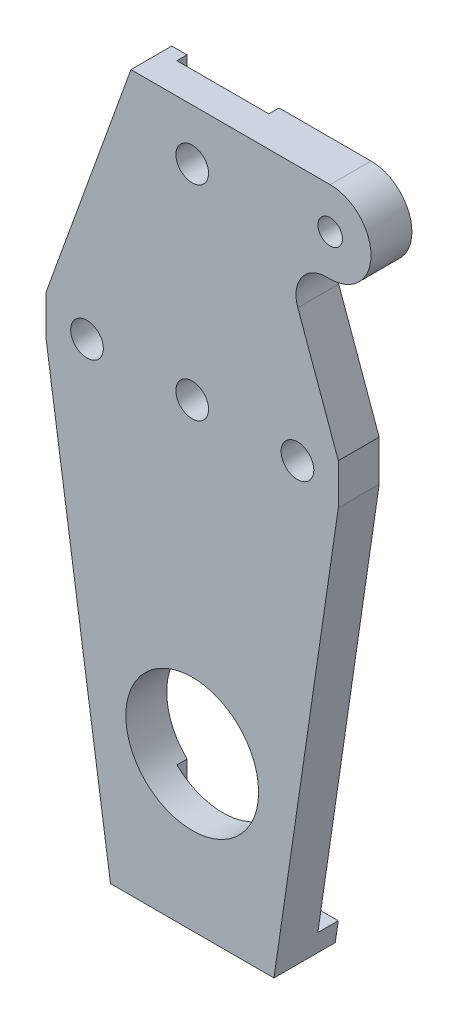
ISO-10303-21;
HEADER;
FILE_DESCRIPTION(('STEP AP214'),'2;1');
FILE_NAME('part.step','',(''),(''),'','','');
FILE_SCHEMA(('AUTOMOTIVE_DESIGN { 1 0 10303 214 1 1 1 1 }'));
ENDSEC;
DATA;
#1=APPLICATION_CONTEXT('core data for automotive mechanical design processes');
#2=APPLICATION_PROTOCOL_DEFINITION('international standard','automotive_design',2000,#1);
#3=PRODUCT_CONTEXT('',#1,'mechanical');
#4=PRODUCT('Part','Part','',(#3));
#5=PRODUCT_RELATED_PRODUCT_CATEGORY('part','',(#4));
#6=PRODUCT_DEFINITION_FORMATION('','',#4);
#7=PRODUCT_DEFINITION_CONTEXT('part definition',#1,'design');
#8=PRODUCT_DEFINITION('design','',#6,#7);
#9=PRODUCT_DEFINITION_SHAPE('','',#8);
#10=(LENGTH_UNIT() NAMED_UNIT(*) SI_UNIT(.MILLI.,.METRE.));
#11=(NAMED_UNIT(*) PLANE_ANGLE_UNIT() SI_UNIT($,.RADIAN.));
#12=(NAMED_UNIT(*) SI_UNIT($,.STERADIAN.) SOLID_ANGLE_UNIT());
#13=UNCERTAINTY_MEASURE_WITH_UNIT(LENGTH_MEASURE(1.E-05),#10,'distance_accuracy_value','');
#14=(GEOMETRIC_REPRESENTATION_CONTEXT(3) GLOBAL_UNCERTAINTY_ASSIGNED_CONTEXT((#13)) GLOBAL_UNIT_ASSIGNED_CONTEXT((#10,
#11,#12)) REPRESENTATION_CONTEXT('',''));
#15=CARTESIAN_POINT('',(0.,0.,0.));
#16=DIRECTION('',(0.,0.,1.));
#17=DIRECTION('',(1.,0.,0.));
#18=AXIS2_PLACEMENT_3D('',#15,#16,#17);
#19=CARTESIAN_POINT('',(0.,0.,-4.));
#20=DIRECTION('',(0.,0.,1.));
#21=DIRECTION('',(1.,0.,0.));
#22=AXIS2_PLACEMENT_3D('',#19,#20,#21);
#23=PLANE('',#22);
#24=CARTESIAN_POINT('',(33.8406060605526,7.45454545454557,-4.));
#25=DIRECTION('',(0.,0.,1.));
#26=DIRECTION('',(1.,0.,0.));
#27=AXIS2_PLACEMENT_3D('',#24,#25,#26);
#28=CIRCLE('',#27,3.25);
#29=CARTESIAN_POINT('',(30.5906060605525,7.45454545454557,-4.));
#30=VERTEX_POINT('',#29);
#31=EDGE_CURVE('E102',#30,#30,#28,.T.);
#32=ORIENTED_EDGE('',*,*,#31,.T.);
#33=EDGE_LOOP('',(#32));
#34=FACE_BOUND('',#33,.T.);
#35=CARTESIAN_POINT('',(37.0406060606563,28.4545454545455,-4.));
#36=DIRECTION('',(0.,0.,1.));
#37=DIRECTION('',(1.,0.,0.));
#38=AXIS2_PLACEMENT_3D('',#35,#36,#37);
#39=CIRCLE('',#38,1.20000000000005);
#40=CARTESIAN_POINT('',(38.2406060606563,28.4545454545455,-4.));
#41=VERTEX_POINT('',#40);
#42=EDGE_CURVE('E337',#41,#41,#39,.T.);
#43=ORIENTED_EDGE('',*,*,#42,.T.);
#44=EDGE_LOOP('',(#43));
#45=FACE_BOUND('',#44,.T.);
#46=DIRECTION('',(1.,-1.31715607146005E-13,0.));
#47=VECTOR('',#46,1.);
#48=CARTESIAN_POINT('',(-4.68189112673478E-12,-35.5454545454508,-4.));
#49=LINE('',#48,#47);
#50=CARTESIAN_POINT('',(28.0406060603391,-35.5454545454544,-4.));
#51=VERTEX_POINT('',#50);
#52=CARTESIAN_POINT('',(31.8336293163268,-35.545454545455,-4.));
#53=VERTEX_POINT('',#52);
#54=EDGE_CURVE('E403',#51,#53,#49,.T.);
#55=ORIENTED_EDGE('',*,*,#54,.F.);
#56=DIRECTION('',(0.,1.,0.));
#57=VECTOR('',#56,1.);
#58=CARTESIAN_POINT('',(28.040606060556,0.,-4.));
#59=LINE('',#58,#57);
#60=CARTESIAN_POINT('',(28.040606060556,-27.2358703052891,-4.));
#61=VERTEX_POINT('',#60);
#62=EDGE_CURVE('E316',#51,#61,#59,.T.);
#63=ORIENTED_EDGE('',*,*,#62,.T.);
#64=CARTESIAN_POINT('',(23.5406060605519,-22.545454545429,-4.));
#65=DIRECTION('',(0.,0.,1.));
#66=DIRECTION('',(1.,0.,0.));
#67=AXIS2_PLACEMENT_3D('',#64,#65,#66);
#68=CIRCLE('',#67,6.49999999997106);
#69=CARTESIAN_POINT('',(28.040606060556,-17.8550387855671,-4.));
#70=VERTEX_POINT('',#69);
#71=EDGE_CURVE('E313',#61,#70,#68,.T.);
#72=ORIENTED_EDGE('',*,*,#71,.T.);
#73=DIRECTION('',(0.,1.,0.));
#74=VECTOR('',#73,1.);
#75=CARTESIAN_POINT('',(28.040606060556,0.,-4.));
#76=LINE('',#75,#74);
#77=CARTESIAN_POINT('',(28.040606060556,32.4545454545455,-4.));
#78=VERTEX_POINT('',#77);
#79=EDGE_CURVE('E335',#70,#78,#76,.T.);
#80=ORIENTED_EDGE('',*,*,#79,.T.);
#81=DIRECTION('',(1.,0.,0.));
#82=VECTOR('',#81,1.);
#83=CARTESIAN_POINT('',(0.,32.4545454545455,-4.));
#84=LINE('',#83,#82);
#85=CARTESIAN_POINT('',(37.0406060605939,32.4545454545455,-4.));
#86=VERTEX_POINT('',#85);
#87=EDGE_CURVE('E333',#78,#86,#84,.T.);
#88=ORIENTED_EDGE('',*,*,#87,.T.);
#89=CARTESIAN_POINT('',(37.0406060606563,28.4545454545455,-4.));
#90=DIRECTION('',(0.,0.,1.));
#91=DIRECTION('',(1.,0.,0.));
#92=AXIS2_PLACEMENT_3D('',#89,#90,#91);
#93=CIRCLE('',#92,3.99999999999998);
#94=CARTESIAN_POINT('',(37.0406060607188,24.4545454545455,-4.));
#95=VERTEX_POINT('',#94);
#96=EDGE_CURVE('E330',#95,#86,#93,.T.);
#97=ORIENTED_EDGE('',*,*,#96,.F.);
#98=DIRECTION('',(-1.,0.,0.));
#99=VECTOR('',#98,1.);
#100=CARTESIAN_POINT('',(0.,24.4545454545455,-4.));
#101=LINE('',#100,#99);
#102=CARTESIAN_POINT('',(36.6995350994455,24.4545454545455,-4.));
#103=VERTEX_POINT('',#102);
#104=EDGE_CURVE('E328',#95,#103,#101,.T.);
#105=ORIENTED_EDGE('',*,*,#104,.T.);
#106=CARTESIAN_POINT('',(36.6995351004983,21.4545454540245,-4.));
#107=DIRECTION('',(0.,0.,1.));
#108=DIRECTION('',(1.,0.,0.));
#109=AXIS2_PLACEMENT_3D('',#106,#107,#108);
#110=CIRCLE('',#109,3.00000000052108);
#111=CARTESIAN_POINT('',(33.8776557209874,20.4362150702011,-4.));
#112=VERTEX_POINT('',#111);
#113=EDGE_CURVE('E326',#103,#112,#110,.T.);
#114=ORIENTED_EDGE('',*,*,#113,.T.);
#115=DIRECTION('',(0.339443461497206,-0.940626459571915,0.));
#116=VECTOR('',#115,1.);
#117=CARTESIAN_POINT('',(36.4992780165337,13.1714785885564,-4.));
#118=LINE('',#117,#116);
#119=CARTESIAN_POINT('',(37.8406060605562,9.45454545451283,-4.));
#120=VERTEX_POINT('',#119);
#121=EDGE_CURVE('E324',#112,#120,#118,.T.);
#122=ORIENTED_EDGE('',*,*,#121,.T.);
#123=DIRECTION('',(0.,1.,0.));
#124=VECTOR('',#123,1.);
#125=CARTESIAN_POINT('',(37.8406060605559,-1.05028780285499E-12,-4.));
#126=LINE('',#125,#124);
#127=CARTESIAN_POINT('',(37.8406060605561,5.45454545451283,-4.));
#128=VERTEX_POINT('',#127);
#129=EDGE_CURVE('E321',#128,#120,#126,.T.);
#130=ORIENTED_EDGE('',*,*,#129,.F.);
#131=DIRECTION('',(0.144964015023223,0.989436927928378,0.));
#132=VECTOR('',#131,1.);
#133=CARTESIAN_POINT('',(36.263041707377,-5.31295727344885,-4.));
#134=LINE('',#133,#132);
#135=EDGE_CURVE('E319',#53,#128,#134,.T.);
#136=ORIENTED_EDGE('',*,*,#135,.F.);
#137=EDGE_LOOP('',(#55,#63,#72,#80,#88,#97,#105,#114,#122,#130,#136));
#138=FACE_BOUND('',#137,.T.);
#139=ADVANCED_FACE('F94',(#34,#45,#138),#23,.F.);
#140=CARTESIAN_POINT('',(19.0406060605561,0.,-4.));
#141=DIRECTION('',(1.,0.,0.));
#142=DIRECTION('',(0.,0.,-1.));
#143=AXIS2_PLACEMENT_3D('',#140,#141,#142);
#144=PLANE('',#143);
#145=DIRECTION('',(0.,0.,1.));
#146=VECTOR('',#145,1.);
#147=CARTESIAN_POINT('',(19.0406060605561,32.4545454545455,-4.));
#148=LINE('',#147,#146);
#149=CARTESIAN_POINT('',(19.0406060605561,32.4545454545455,-4.));
#150=VERTEX_POINT('',#149);
#151=CARTESIAN_POINT('',(19.0406060605561,32.4545454545455,-3.));
#152=VERTEX_POINT('',#151);
#153=EDGE_CURVE('E409',#150,#152,#148,.T.);
#154=ORIENTED_EDGE('',*,*,#153,.T.);
#155=DIRECTION('',(0.,1.,0.));
#156=VECTOR('',#155,1.);
#157=CARTESIAN_POINT('',(19.0406060605561,0.,-3.));
#158=LINE('',#157,#156);
#159=CARTESIAN_POINT('',(19.0406060605561,-17.8550387856416,-3.));
#160=VERTEX_POINT('',#159);
#161=EDGE_CURVE('E300',#160,#152,#158,.T.);
#162=ORIENTED_EDGE('',*,*,#161,.F.);
#163=DIRECTION('',(0.,0.,1.));
#164=VECTOR('',#163,1.);
#165=CARTESIAN_POINT('',(19.0406060605561,-17.8550387856416,-4.));
#166=LINE('',#165,#164);
#167=CARTESIAN_POINT('',(19.0406060605561,-17.8550387856416,-4.));
#168=VERTEX_POINT('',#167);
#169=EDGE_CURVE('E405',#168,#160,#166,.T.);
#170=ORIENTED_EDGE('',*,*,#169,.F.);
#171=DIRECTION('',(0.,1.,0.));
#172=VECTOR('',#171,1.);
#173=CARTESIAN_POINT('',(19.0406060605561,0.,-4.));
#174=LINE('',#173,#172);
#175=EDGE_CURVE('E449',#168,#150,#174,.T.);
#176=ORIENTED_EDGE('',*,*,#175,.T.);
#177=EDGE_LOOP('',(#154,#162,#170,#176));
#178=FACE_BOUND('',#177,.T.);
#179=ADVANCED_FACE('F474',(#178),#144,.T.);
#180=CARTESIAN_POINT('',(28.040606060556,0.,-4.));
#181=DIRECTION('',(1.,0.,0.));
#182=DIRECTION('',(0.,0.,-1.));
#183=AXIS2_PLACEMENT_3D('',#180,#181,#182);
#184=PLANE('',#183);
#185=DIRECTION('',(0.,1.,0.));
#186=VECTOR('',#185,1.);
#187=CARTESIAN_POINT('',(28.040606060556,0.,-3.));
#188=LINE('',#187,#186);
#189=CARTESIAN_POINT('',(28.040606060556,-17.8550387855671,-3.));
#190=VERTEX_POINT('',#189);
#191=CARTESIAN_POINT('',(28.040606060556,32.4545454545455,-3.));
#192=VERTEX_POINT('',#191);
#193=EDGE_CURVE('E294',#190,#192,#188,.T.);
#194=ORIENTED_EDGE('',*,*,#193,.T.);
#195=DIRECTION('',(0.,0.,1.));
#196=VECTOR('',#195,1.);
#197=CARTESIAN_POINT('',(28.040606060556,32.4545454545455,-4.));
#198=LINE('',#197,#196);
#199=EDGE_CURVE('E364',#78,#192,#198,.T.);
#200=ORIENTED_EDGE('',*,*,#199,.F.);
#201=ORIENTED_EDGE('',*,*,#79,.F.);
#202=DIRECTION('',(0.,0.,1.));
#203=VECTOR('',#202,1.);
#204=CARTESIAN_POINT('',(28.040606060556,-17.8550387855671,-4.));
#205=LINE('',#204,#203);
#206=EDGE_CURVE('E360',#70,#190,#205,.T.);
#207=ORIENTED_EDGE('',*,*,#206,.T.);
#208=EDGE_LOOP('',(#194,#200,#201,#207));
#209=FACE_BOUND('',#208,.T.);
#210=ADVANCED_FACE('F479',(#209),#184,.F.);
#211=CARTESIAN_POINT('',(19.0406060605561,0.,-4.));
#212=DIRECTION('',(1.,0.,0.));
#213=DIRECTION('',(0.,0.,-1.));
#214=AXIS2_PLACEMENT_3D('',#211,#212,#213);
#215=PLANE('',#214);
#216=DIRECTION('',(0.,0.,1.));
#217=VECTOR('',#216,1.);
#218=CARTESIAN_POINT('',(19.0406060605561,-27.2358703052163,-4.));
#219=LINE('',#218,#217);
#220=CARTESIAN_POINT('',(19.0406060605561,-27.2358703052163,-4.));
#221=VERTEX_POINT('',#220);
#222=CARTESIAN_POINT('',(19.0406060605561,-27.2358703052163,-3.));
#223=VERTEX_POINT('',#222);
#224=EDGE_CURVE('E399',#221,#223,#219,.T.);
#225=ORIENTED_EDGE('',*,*,#224,.T.);
#226=DIRECTION('',(0.,1.,0.));
#227=VECTOR('',#226,1.);
#228=CARTESIAN_POINT('',(19.0406060605561,0.,-3.));
#229=LINE('',#228,#227);
#230=CARTESIAN_POINT('',(19.0406060605561,-37.5454545454545,-3.));
#231=VERTEX_POINT('',#230);
#232=EDGE_CURVE('E393',#231,#223,#229,.T.);
#233=ORIENTED_EDGE('',*,*,#232,.F.);
#234=DIRECTION('',(0.,0.,1.));
#235=VECTOR('',#234,1.);
#236=CARTESIAN_POINT('',(19.0406060605561,-37.5454545454545,-4.));
#237=LINE('',#236,#235);
#238=CARTESIAN_POINT('',(19.0406060605561,-37.5454545454545,-6.));
#239=VERTEX_POINT('',#238);
#240=EDGE_CURVE('E271',#239,#231,#237,.T.);
#241=ORIENTED_EDGE('',*,*,#240,.F.);
#242=DIRECTION('',(0.,1.,0.));
#243=VECTOR('',#242,1.);
#244=CARTESIAN_POINT('',(19.0406060605561,0.,-6.));
#245=LINE('',#244,#243);
#246=CARTESIAN_POINT('',(19.0406060605561,-35.5454545454547,-6.));
#247=VERTEX_POINT('',#246);
#248=EDGE_CURVE('E263',#239,#247,#245,.T.);
#249=ORIENTED_EDGE('',*,*,#248,.T.);
#250=DIRECTION('',(0.,0.,1.));
#251=VECTOR('',#250,1.);
#252=CARTESIAN_POINT('',(19.0406060605561,-35.5454545454547,-6.));
#253=LINE('',#252,#251);
#254=CARTESIAN_POINT('',(19.0406060605561,-35.5454545454547,-4.));
#255=VERTEX_POINT('',#254);
#256=EDGE_CURVE('E249',#247,#255,#253,.T.);
#257=ORIENTED_EDGE('',*,*,#256,.T.);
#258=DIRECTION('',(0.,1.,0.));
#259=VECTOR('',#258,1.);
#260=CARTESIAN_POINT('',(19.0406060605561,0.,-4.));
#261=LINE('',#260,#259);
#262=EDGE_CURVE('E408',#255,#221,#261,.T.);
#263=ORIENTED_EDGE('',*,*,#262,.T.);
#264=EDGE_LOOP('',(#225,#233,#241,#249,#257,#263));
#265=FACE_BOUND('',#264,.T.);
#266=ADVANCED_FACE('F268',(#265),#215,.T.);
#267=CARTESIAN_POINT('',(23.5406060605519,-22.545454545429,-4.));
#268=DIRECTION('',(0.,0.,1.));
#269=DIRECTION('',(1.,0.,0.));
#270=AXIS2_PLACEMENT_3D('',#267,#268,#269);
#271=CYLINDRICAL_SURFACE('',#270,6.49999999997106);
#272=CARTESIAN_POINT('',(23.5406060605519,-22.545454545429,0.));
#273=DIRECTION('',(0.,0.,1.));
#274=DIRECTION('',(1.,0.,0.));
#275=AXIS2_PLACEMENT_3D('',#272,#273,#274);
#276=CIRCLE('',#275,6.49999999997106);
#277=CARTESIAN_POINT('',(30.040606060523,-22.545454545429,0.));
#278=VERTEX_POINT('',#277);
#279=EDGE_CURVE('E404',#278,#278,#276,.T.);
#280=ORIENTED_EDGE('',*,*,#279,.T.);
#281=EDGE_LOOP('',(#280));
#282=FACE_BOUND('',#281,.T.);
#283=ORIENTED_EDGE('',*,*,#169,.T.);
#284=CARTESIAN_POINT('',(23.5406060605519,-22.545454545429,-3.));
#285=DIRECTION('',(0.,0.,1.));
#286=DIRECTION('',(1.,0.,0.));
#287=AXIS2_PLACEMENT_3D('',#284,#285,#286);
#288=CIRCLE('',#287,6.49999999997106);
#289=EDGE_CURVE('E292',#190,#160,#288,.T.);
#290=ORIENTED_EDGE('',*,*,#289,.F.);
#291=ORIENTED_EDGE('',*,*,#206,.F.);
#292=ORIENTED_EDGE('',*,*,#71,.F.);
#293=DIRECTION('',(0.,0.,1.));
#294=VECTOR('',#293,1.);
#295=CARTESIAN_POINT('',(28.040606060556,-27.2358703052891,-4.));
#296=LINE('',#295,#294);
#297=CARTESIAN_POINT('',(28.040606060556,-27.2358703052891,-3.));
#298=VERTEX_POINT('',#297);
#299=EDGE_CURVE('E340',#61,#298,#296,.T.);
#300=ORIENTED_EDGE('',*,*,#299,.T.);
#301=CARTESIAN_POINT('',(23.5406060605519,-22.545454545429,-3.));
#302=DIRECTION('',(0.,0.,1.));
#303=DIRECTION('',(1.,0.,0.));
#304=AXIS2_PLACEMENT_3D('',#301,#302,#303);
#305=CIRCLE('',#304,6.49999999997106);
#306=EDGE_CURVE('E363',#223,#298,#305,.T.);
#307=ORIENTED_EDGE('',*,*,#306,.F.);
#308=ORIENTED_EDGE('',*,*,#224,.F.);
#309=CARTESIAN_POINT('',(23.5406060605519,-22.545454545429,-4.));
#310=DIRECTION('',(0.,0.,1.));
#311=DIRECTION('',(1.,0.,0.));
#312=AXIS2_PLACEMENT_3D('',#309,#310,#311);
#313=CIRCLE('',#312,6.49999999997106);
#314=EDGE_CURVE('E427',#168,#221,#313,.T.);
#315=ORIENTED_EDGE('',*,*,#314,.F.);
#316=EDGE_LOOP('',(#283,#290,#291,#292,#300,#307,#308,#315));
#317=FACE_BOUND('',#316,.T.);
#318=ADVANCED_FACE('F533',(#282,#317),#271,.F.);
#319=CARTESIAN_POINT('',(0.,-37.5454545454545,-4.));
#320=DIRECTION('',(0.,1.,0.));
#321=DIRECTION('',(-1.,0.,0.));
#322=AXIS2_PLACEMENT_3D('',#319,#320,#321);
#323=PLANE('',#322);
#324=DIRECTION('',(-1.,0.,0.));
#325=VECTOR('',#324,1.);
#326=CARTESIAN_POINT('',(0.,-37.5454545454545,0.));
#327=LINE('',#326,#325);
#328=CARTESIAN_POINT('',(31.5406060605105,-37.5454545454544,0.));
#329=VERTEX_POINT('',#328);
#330=CARTESIAN_POINT('',(15.5406060606017,-37.5454545454545,0.));
#331=VERTEX_POINT('',#330);
#332=EDGE_CURVE('E424',#329,#331,#327,.T.);
#333=ORIENTED_EDGE('',*,*,#332,.T.);
#334=DIRECTION('',(0.,0.,1.));
#335=VECTOR('',#334,1.);
#336=CARTESIAN_POINT('',(15.5406060606017,-37.5454545454545,-4.));
#337=LINE('',#336,#335);
#338=CARTESIAN_POINT('',(15.5406060606017,-37.5454545454545,-6.));
#339=VERTEX_POINT('',#338);
#340=EDGE_CURVE('E419',#339,#331,#337,.T.);
#341=ORIENTED_EDGE('',*,*,#340,.F.);
#342=DIRECTION('',(-1.,0.,0.));
#343=VECTOR('',#342,1.);
#344=CARTESIAN_POINT('',(0.,-37.5454545454545,-6.));
#345=LINE('',#344,#343);
#346=EDGE_CURVE('E257',#239,#339,#345,.T.);
#347=ORIENTED_EDGE('',*,*,#346,.F.);
#348=ORIENTED_EDGE('',*,*,#240,.T.);
#349=DIRECTION('',(-1.,0.,0.));
#350=VECTOR('',#349,1.);
#351=CARTESIAN_POINT('',(0.,-37.5454545454545,-3.));
#352=LINE('',#351,#350);
#353=CARTESIAN_POINT('',(28.040606060556,-37.5454545454545,-3.));
#354=VERTEX_POINT('',#353);
#355=EDGE_CURVE('E395',#354,#231,#352,.T.);
#356=ORIENTED_EDGE('',*,*,#355,.F.);
#357=DIRECTION('',(0.,0.,1.));
#358=VECTOR('',#357,1.);
#359=CARTESIAN_POINT('',(28.040606060556,-37.5454545454545,-4.));
#360=LINE('',#359,#358);
#361=CARTESIAN_POINT('',(28.040606060556,-37.5454545454545,-6.));
#362=VERTEX_POINT('',#361);
#363=EDGE_CURVE('E386',#362,#354,#360,.T.);
#364=ORIENTED_EDGE('',*,*,#363,.F.);
#365=DIRECTION('',(-1.,0.,0.));
#366=VECTOR('',#365,1.);
#367=CARTESIAN_POINT('',(0.,-37.5454545454545,-6.));
#368=LINE('',#367,#366);
#369=CARTESIAN_POINT('',(31.5406060605105,-37.5454545454544,-6.));
#370=VERTEX_POINT('',#369);
#371=EDGE_CURVE('E279',#370,#362,#368,.T.);
#372=ORIENTED_EDGE('',*,*,#371,.F.);
#373=DIRECTION('',(0.,0.,1.));
#374=VECTOR('',#373,1.);
#375=CARTESIAN_POINT('',(31.5406060605105,-37.5454545454544,-4.));
#376=LINE('',#375,#374);
#377=EDGE_CURVE('E383',#370,#329,#376,.T.);
#378=ORIENTED_EDGE('',*,*,#377,.T.);
#379=EDGE_LOOP('',(#333,#341,#347,#348,#356,#364,#372,#378));
#380=FACE_BOUND('',#379,.T.);
#381=ADVANCED_FACE('F535',(#380),#323,.F.);
#382=CARTESIAN_POINT('',(9.82877919065661,1.44003043957285,-4.));
#383=DIRECTION('',(0.989436927928378,0.144964015023226,0.));
#384=DIRECTION('',(-0.144964015023226,0.989436927928378,0.));
#385=AXIS2_PLACEMENT_3D('',#382,#383,#384);
#386=PLANE('',#385);
#387=DIRECTION('',(-0.144964015023226,0.989436927928378,0.));
#388=VECTOR('',#387,1.);
#389=CARTESIAN_POINT('',(9.82877919065661,1.44003043957285,-4.));
#390=LINE('',#389,#388);
#391=CARTESIAN_POINT('',(15.2475828047855,-35.5454545454549,-4.));
#392=VERTEX_POINT('',#391);
#393=CARTESIAN_POINT('',(9.24060606055605,5.45454545451281,-4.));
#394=VERTEX_POINT('',#393);
#395=EDGE_CURVE('E440',#392,#394,#390,.T.);
#396=ORIENTED_EDGE('',*,*,#395,.F.);
#397=DIRECTION('',(0.,0.,1.));
#398=VECTOR('',#397,1.);
#399=CARTESIAN_POINT('',(15.2475828047855,-35.5454545454549,-6.));
#400=LINE('',#399,#398);
#401=CARTESIAN_POINT('',(15.2475828047855,-35.5454545454549,-6.));
#402=VERTEX_POINT('',#401);
#403=EDGE_CURVE('E109',#402,#392,#400,.T.);
#404=ORIENTED_EDGE('',*,*,#403,.F.);
#405=DIRECTION('',(-0.144964015023226,0.989436927928378,0.));
#406=VECTOR('',#405,1.);
#407=CARTESIAN_POINT('',(9.82877919065661,1.44003043957285,-6.));
#408=LINE('',#407,#406);
#409=EDGE_CURVE('E265',#339,#402,#408,.T.);
#410=ORIENTED_EDGE('',*,*,#409,.F.);
#411=ORIENTED_EDGE('',*,*,#340,.T.);
#412=DIRECTION('',(-0.144964015023226,0.989436927928378,0.));
#413=VECTOR('',#412,1.);
#414=CARTESIAN_POINT('',(9.82877919065661,1.44003043957285,0.));
#415=LINE('',#414,#413);
#416=CARTESIAN_POINT('',(9.24060606055605,5.45454545451281,0.));
#417=VERTEX_POINT('',#416);
#418=EDGE_CURVE('E426',#331,#417,#415,.T.);
#419=ORIENTED_EDGE('',*,*,#418,.T.);
#420=DIRECTION('',(0.,0.,1.));
#421=VECTOR('',#420,1.);
#422=CARTESIAN_POINT('',(9.24060606055605,5.45454545451281,-4.));
#423=LINE('',#422,#421);
#424=EDGE_CURVE('E416',#394,#417,#423,.T.);
#425=ORIENTED_EDGE('',*,*,#424,.F.);
#426=EDGE_LOOP('',(#396,#404,#410,#411,#419,#425));
#427=FACE_BOUND('',#426,.T.);
#428=ADVANCED_FACE('F550',(#427),#386,.F.);
#429=CARTESIAN_POINT('',(9.24060606055605,0.,-4.));
#430=DIRECTION('',(1.,0.,0.));
#431=DIRECTION('',(0.,0.,-1.));
#432=AXIS2_PLACEMENT_3D('',#429,#430,#431);
#433=PLANE('',#432);
#434=DIRECTION('',(0.,1.,0.));
#435=VECTOR('',#434,1.);
#436=CARTESIAN_POINT('',(9.24060606055605,0.,0.));
#437=LINE('',#436,#435);
#438=CARTESIAN_POINT('',(9.24060606055605,9.45454545451281,0.));
#439=VERTEX_POINT('',#438);
#440=EDGE_CURVE('E429',#417,#439,#437,.T.);
#441=ORIENTED_EDGE('',*,*,#440,.T.);
#442=DIRECTION('',(0.,0.,1.));
#443=VECTOR('',#442,1.);
#444=CARTESIAN_POINT('',(9.24060606055605,9.45454545451281,-4.));
#445=LINE('',#444,#443);
#446=CARTESIAN_POINT('',(9.24060606055605,9.45454545451281,-4.));
#447=VERTEX_POINT('',#446);
#448=EDGE_CURVE('E414',#447,#439,#445,.T.);
#449=ORIENTED_EDGE('',*,*,#448,.F.);
#450=DIRECTION('',(0.,1.,0.));
#451=VECTOR('',#450,1.);
#452=CARTESIAN_POINT('',(9.24060606055605,0.,-4.));
#453=LINE('',#452,#451);
#454=EDGE_CURVE('E442',#394,#447,#453,.T.);
#455=ORIENTED_EDGE('',*,*,#454,.F.);
#456=ORIENTED_EDGE('',*,*,#424,.T.);
#457=EDGE_LOOP('',(#441,#449,#455,#456));
#458=FACE_BOUND('',#457,.T.);
#459=ADVANCED_FACE('F546',(#458),#433,.F.);
#460=CARTESIAN_POINT('',(5.15714910564019,-1.861058155511,-4.));
#461=DIRECTION('',(-0.940626459571913,0.33944346149721,0.));
#462=DIRECTION('',(-0.33944346149721,-0.940626459571913,0.));
#463=AXIS2_PLACEMENT_3D('',#460,#461,#462);
#464=PLANE('',#463);
#465=DIRECTION('',(-0.33944346149721,-0.940626459571913,0.));
#466=VECTOR('',#465,1.);
#467=CARTESIAN_POINT('',(5.15714910564019,-1.861058155511,0.));
#468=LINE('',#467,#466);
#469=CARTESIAN_POINT('',(17.5406060605561,32.4545454545455,0.));
#470=VERTEX_POINT('',#469);
#471=EDGE_CURVE('E432',#470,#439,#468,.T.);
#472=ORIENTED_EDGE('',*,*,#471,.F.);
#473=DIRECTION('',(0.,0.,1.));
#474=VECTOR('',#473,1.);
#475=CARTESIAN_POINT('',(17.5406060605561,32.4545454545455,-4.));
#476=LINE('',#475,#474);
#477=CARTESIAN_POINT('',(17.5406060605561,32.4545454545455,-4.));
#478=VERTEX_POINT('',#477);
#479=EDGE_CURVE('E412',#478,#470,#476,.T.);
#480=ORIENTED_EDGE('',*,*,#479,.F.);
#481=DIRECTION('',(-0.33944346149721,-0.940626459571913,0.));
#482=VECTOR('',#481,1.);
#483=CARTESIAN_POINT('',(5.15714910564019,-1.861058155511,-4.));
#484=LINE('',#483,#482);
#485=EDGE_CURVE('E444',#478,#447,#484,.T.);
#486=ORIENTED_EDGE('',*,*,#485,.T.);
#487=ORIENTED_EDGE('',*,*,#448,.T.);
#488=EDGE_LOOP('',(#472,#480,#486,#487));
#489=FACE_BOUND('',#488,.T.);
#490=ADVANCED_FACE('F542',(#489),#464,.T.);
#491=CARTESIAN_POINT('',(0.,32.4545454545455,-4.));
#492=DIRECTION('',(0.,-1.,0.));
#493=DIRECTION('',(0.,0.,-1.));
#494=AXIS2_PLACEMENT_3D('',#491,#492,#493);
#495=PLANE('',#494);
#496=DIRECTION('',(1.,0.,0.));
#497=VECTOR('',#496,1.);
#498=CARTESIAN_POINT('',(0.,32.4545454545455,0.));
#499=LINE('',#498,#497);
#500=CARTESIAN_POINT('',(37.0406060605939,32.4545454545455,0.));
#501=VERTEX_POINT('',#500);
#502=EDGE_CURVE('E435',#470,#501,#499,.T.);
#503=ORIENTED_EDGE('',*,*,#502,.T.);
#504=DIRECTION('',(0.,0.,1.));
#505=VECTOR('',#504,1.);
#506=CARTESIAN_POINT('',(37.0406060605939,32.4545454545455,-4.));
#507=LINE('',#506,#505);
#508=EDGE_CURVE('E367',#86,#501,#507,.T.);
#509=ORIENTED_EDGE('',*,*,#508,.F.);
#510=ORIENTED_EDGE('',*,*,#87,.F.);
#511=ORIENTED_EDGE('',*,*,#199,.T.);
#512=DIRECTION('',(1.,0.,0.));
#513=VECTOR('',#512,1.);
#514=CARTESIAN_POINT('',(0.,32.4545454545455,-3.));
#515=LINE('',#514,#513);
#516=EDGE_CURVE('E298',#152,#192,#515,.T.);
#517=ORIENTED_EDGE('',*,*,#516,.F.);
#518=ORIENTED_EDGE('',*,*,#153,.F.);
#519=DIRECTION('',(1.,0.,0.));
#520=VECTOR('',#519,1.);
#521=CARTESIAN_POINT('',(0.,32.4545454545455,-4.));
#522=LINE('',#521,#520);
#523=EDGE_CURVE('E447',#478,#150,#522,.T.);
#524=ORIENTED_EDGE('',*,*,#523,.F.);
#525=ORIENTED_EDGE('',*,*,#479,.T.);
#526=EDGE_LOOP('',(#503,#509,#510,#511,#517,#518,#524,#525));
#527=FACE_BOUND('',#526,.T.);
#528=ADVANCED_FACE('F538',(#527),#495,.F.);
#529=CARTESIAN_POINT('',(0.,0.,-4.));
#530=DIRECTION('',(0.,0.,1.));
#531=DIRECTION('',(1.,0.,0.));
#532=AXIS2_PLACEMENT_3D('',#529,#530,#531);
#533=PLANE('',#532);
#534=CARTESIAN_POINT('',(13.2406060605565,7.45454545454555,-4.));
#535=DIRECTION('',(0.,0.,1.));
#536=DIRECTION('',(1.,0.,0.));
#537=AXIS2_PLACEMENT_3D('',#534,#535,#536);
#538=CIRCLE('',#537,3.24999999999998);
#539=CARTESIAN_POINT('',(16.4906060605565,7.45454545454555,-4.));
#540=VERTEX_POINT('',#539);
#541=EDGE_CURVE('E455',#540,#540,#538,.T.);
#542=ORIENTED_EDGE('',*,*,#541,.T.);
#543=EDGE_LOOP('',(#542));
#544=FACE_BOUND('',#543,.T.);
#545=ORIENTED_EDGE('',*,*,#262,.F.);
#546=DIRECTION('',(-1.,-1.28056840280835E-13,0.));
#547=VECTOR('',#546,1.);
#548=CARTESIAN_POINT('',(4.55183859543727E-12,-35.5454545454569,-4.));
#549=LINE('',#548,#547);
#550=EDGE_CURVE('E253',#255,#392,#549,.T.);
#551=ORIENTED_EDGE('',*,*,#550,.T.);
#552=ORIENTED_EDGE('',*,*,#395,.T.);
#553=ORIENTED_EDGE('',*,*,#454,.T.);
#554=ORIENTED_EDGE('',*,*,#485,.F.);
#555=ORIENTED_EDGE('',*,*,#523,.T.);
#556=ORIENTED_EDGE('',*,*,#175,.F.);
#557=ORIENTED_EDGE('',*,*,#314,.T.);
#558=EDGE_LOOP('',(#545,#551,#552,#553,#554,#555,#556,#557));
#559=FACE_BOUND('',#558,.T.);
#560=ADVANCED_FACE('F541',(#544,#559),#533,.F.);
#561=CARTESIAN_POINT('',(0.,0.,0.));
#562=DIRECTION('',(0.,0.,1.));
#563=DIRECTION('',(1.,0.,0.));
#564=AXIS2_PLACEMENT_3D('',#561,#562,#563);
#565=PLANE('',#564);
#566=ORIENTED_EDGE('',*,*,#418,.F.);
#567=ORIENTED_EDGE('',*,*,#332,.F.);
#568=DIRECTION('',(0.144964015023223,0.989436927928378,0.));
#569=VECTOR('',#568,1.);
#570=CARTESIAN_POINT('',(36.263041707377,-5.31295727344885,0.));
#571=LINE('',#570,#569);
#572=CARTESIAN_POINT('',(37.8406060605561,5.45454545451283,0.));
#573=VERTEX_POINT('',#572);
#574=EDGE_CURVE('E308',#329,#573,#571,.T.);
#575=ORIENTED_EDGE('',*,*,#574,.T.);
#576=DIRECTION('',(0.,1.,0.));
#577=VECTOR('',#576,1.);
#578=CARTESIAN_POINT('',(37.8406060605559,-1.05028780285499E-12,0.));
#579=LINE('',#578,#577);
#580=CARTESIAN_POINT('',(37.8406060605562,9.45454545451283,0.));
#581=VERTEX_POINT('',#580);
#582=EDGE_CURVE('E342',#573,#581,#579,.T.);
#583=ORIENTED_EDGE('',*,*,#582,.T.);
#584=DIRECTION('',(0.339443461497206,-0.940626459571915,0.));
#585=VECTOR('',#584,1.);
#586=CARTESIAN_POINT('',(36.4992780165337,13.1714785885564,0.));
#587=LINE('',#586,#585);
#588=CARTESIAN_POINT('',(33.8776557209874,20.4362150702011,0.));
#589=VERTEX_POINT('',#588);
#590=EDGE_CURVE('E345',#589,#581,#587,.T.);
#591=ORIENTED_EDGE('',*,*,#590,.F.);
#592=CARTESIAN_POINT('',(36.6995351004983,21.4545454540245,0.));
#593=DIRECTION('',(0.,0.,1.));
#594=DIRECTION('',(1.,0.,0.));
#595=AXIS2_PLACEMENT_3D('',#592,#593,#594);
#596=CIRCLE('',#595,3.00000000052108);
#597=CARTESIAN_POINT('',(36.6995350994455,24.4545454545455,0.));
#598=VERTEX_POINT('',#597);
#599=EDGE_CURVE('E348',#598,#589,#596,.T.);
#600=ORIENTED_EDGE('',*,*,#599,.F.);
#601=DIRECTION('',(-1.,0.,0.));
#602=VECTOR('',#601,1.);
#603=CARTESIAN_POINT('',(0.,24.4545454545455,0.));
#604=LINE('',#603,#602);
#605=CARTESIAN_POINT('',(37.0406060607188,24.4545454545455,0.));
#606=VERTEX_POINT('',#605);
#607=EDGE_CURVE('E350',#606,#598,#604,.T.);
#608=ORIENTED_EDGE('',*,*,#607,.F.);
#609=CARTESIAN_POINT('',(37.0406060606563,28.4545454545455,0.));
#610=DIRECTION('',(0.,0.,1.));
#611=DIRECTION('',(1.,0.,0.));
#612=AXIS2_PLACEMENT_3D('',#609,#610,#611);
#613=CIRCLE('',#612,3.99999999999998);
#614=EDGE_CURVE('E352',#606,#501,#613,.T.);
#615=ORIENTED_EDGE('',*,*,#614,.T.);
#616=ORIENTED_EDGE('',*,*,#502,.F.);
#617=ORIENTED_EDGE('',*,*,#471,.T.);
#618=ORIENTED_EDGE('',*,*,#440,.F.);
#619=EDGE_LOOP('',(#566,#567,#575,#583,#591,#600,#608,#615,#616,#617,#618));
#620=FACE_BOUND('',#619,.T.);
#621=CARTESIAN_POINT('',(23.5406060605561,7.45454545454557,0.));
#622=DIRECTION('',(0.,0.,1.));
#623=DIRECTION('',(1.,0.,0.));
#624=AXIS2_PLACEMENT_3D('',#621,#622,#623);
#625=CIRCLE('',#624,1.60000000000002);
#626=CARTESIAN_POINT('',(25.1406060605561,7.45454545454557,0.));
#627=VERTEX_POINT('',#626);
#628=EDGE_CURVE('E295',#627,#627,#625,.T.);
#629=ORIENTED_EDGE('',*,*,#628,.F.);
#630=EDGE_LOOP('',(#629));
#631=FACE_BOUND('',#630,.T.);
#632=CARTESIAN_POINT('',(23.5406060605561,27.4545454545456,0.));
#633=DIRECTION('',(0.,0.,1.));
#634=DIRECTION('',(1.,0.,0.));
#635=AXIS2_PLACEMENT_3D('',#632,#633,#634);
#636=CIRCLE('',#635,1.60000000000002);
#637=CARTESIAN_POINT('',(25.1406060605561,27.4545454545456,0.));
#638=VERTEX_POINT('',#637);
#639=EDGE_CURVE('E290',#638,#638,#636,.T.);
#640=ORIENTED_EDGE('',*,*,#639,.F.);
#641=EDGE_LOOP('',(#640));
#642=FACE_BOUND('',#641,.T.);
#643=CARTESIAN_POINT('',(33.8406060605526,7.45454545454557,0.));
#644=DIRECTION('',(0.,0.,1.));
#645=DIRECTION('',(1.,0.,0.));
#646=AXIS2_PLACEMENT_3D('',#643,#644,#645);
#647=CIRCLE('',#646,1.6);
#648=CARTESIAN_POINT('',(35.4406060605525,7.45454545454557,0.));
#649=VERTEX_POINT('',#648);
#650=EDGE_CURVE('E317',#649,#649,#647,.T.);
#651=ORIENTED_EDGE('',*,*,#650,.F.);
#652=EDGE_LOOP('',(#651));
#653=FACE_BOUND('',#652,.T.);
#654=CARTESIAN_POINT('',(37.0406060606563,28.4545454545455,0.));
#655=DIRECTION('',(0.,0.,1.));
#656=DIRECTION('',(1.,0.,0.));
#657=AXIS2_PLACEMENT_3D('',#654,#655,#656);
#658=CIRCLE('',#657,1.20000000000005);
#659=CARTESIAN_POINT('',(38.2406060606563,28.4545454545455,0.));
#660=VERTEX_POINT('',#659);
#661=EDGE_CURVE('E355',#660,#660,#658,.T.);
#662=ORIENTED_EDGE('',*,*,#661,.F.);
#663=EDGE_LOOP('',(#662));
#664=FACE_BOUND('',#663,.T.);
#665=CARTESIAN_POINT('',(13.2406060605565,7.45454545454555,0.));
#666=DIRECTION('',(0.,0.,1.));
#667=DIRECTION('',(1.,0.,0.));
#668=AXIS2_PLACEMENT_3D('',#665,#666,#667);
#669=CIRCLE('',#668,1.6);
#670=CARTESIAN_POINT('',(14.8406060605565,7.45454545454555,0.));
#671=VERTEX_POINT('',#670);
#672=EDGE_CURVE('E400',#671,#671,#669,.T.);
#673=ORIENTED_EDGE('',*,*,#672,.F.);
#674=EDGE_LOOP('',(#673));
#675=FACE_BOUND('',#674,.T.);
#676=ORIENTED_EDGE('',*,*,#279,.F.);
#677=EDGE_LOOP('',(#676));
#678=FACE_BOUND('',#677,.T.);
#679=ADVANCED_FACE('F529',(#620,#631,#642,#653,#664,#675,#678),#565,.T.);
#680=CARTESIAN_POINT('',(13.2406060605565,7.45454545454555,-4.));
#681=DIRECTION('',(0.,0.,1.));
#682=DIRECTION('',(1.,0.,0.));
#683=AXIS2_PLACEMENT_3D('',#680,#681,#682);
#684=CYLINDRICAL_SURFACE('',#683,1.6);
#685=CARTESIAN_POINT('',(13.2406060605565,7.45454545454555,-2.35000000000001));
#686=DIRECTION('',(0.,0.,1.));
#687=DIRECTION('',(1.,0.,0.));
#688=AXIS2_PLACEMENT_3D('',#685,#686,#687);
#689=CIRCLE('',#688,1.6);
#690=CARTESIAN_POINT('',(14.8406060605565,7.45454545454555,-2.35000000000001));
#691=VERTEX_POINT('',#690);
#692=EDGE_CURVE('E458',#691,#691,#689,.F.);
#693=ORIENTED_EDGE('',*,*,#692,.T.);
#694=EDGE_LOOP('',(#693));
#695=FACE_BOUND('',#694,.T.);
#696=ORIENTED_EDGE('',*,*,#672,.T.);
#697=EDGE_LOOP('',(#696));
#698=FACE_BOUND('',#697,.T.);
#699=ADVANCED_FACE('F527',(#695,#698),#684,.F.);
#700=CARTESIAN_POINT('',(0.,0.,-3.));
#701=DIRECTION('',(0.,0.,1.));
#702=DIRECTION('',(1.,0.,0.));
#703=AXIS2_PLACEMENT_3D('',#700,#701,#702);
#704=PLANE('',#703);
#705=ORIENTED_EDGE('',*,*,#306,.T.);
#706=DIRECTION('',(0.,1.,0.));
#707=VECTOR('',#706,1.);
#708=CARTESIAN_POINT('',(28.040606060556,0.,-3.));
#709=LINE('',#708,#707);
#710=EDGE_CURVE('E397',#354,#298,#709,.T.);
#711=ORIENTED_EDGE('',*,*,#710,.F.);
#712=ORIENTED_EDGE('',*,*,#355,.T.);
#713=ORIENTED_EDGE('',*,*,#232,.T.);
#714=EDGE_LOOP('',(#705,#711,#712,#713));
#715=FACE_BOUND('',#714,.T.);
#716=ADVANCED_FACE('F523',(#715),#704,.F.);
#717=CARTESIAN_POINT('',(28.040606060556,0.,-4.));
#718=DIRECTION('',(1.,0.,0.));
#719=DIRECTION('',(0.,0.,-1.));
#720=AXIS2_PLACEMENT_3D('',#717,#718,#719);
#721=PLANE('',#720);
#722=ORIENTED_EDGE('',*,*,#710,.T.);
#723=ORIENTED_EDGE('',*,*,#299,.F.);
#724=ORIENTED_EDGE('',*,*,#62,.F.);
#725=DIRECTION('',(0.,0.,1.));
#726=VECTOR('',#725,1.);
#727=CARTESIAN_POINT('',(28.0406060603391,-35.5454545454544,-6.));
#728=LINE('',#727,#726);
#729=CARTESIAN_POINT('',(28.0406060603391,-35.5454545454544,-6.));
#730=VERTEX_POINT('',#729);
#731=EDGE_CURVE('E288',#730,#51,#728,.T.);
#732=ORIENTED_EDGE('',*,*,#731,.F.);
#733=DIRECTION('',(0.,1.,0.));
#734=VECTOR('',#733,1.);
#735=CARTESIAN_POINT('',(28.040606060556,0.,-6.));
#736=LINE('',#735,#734);
#737=EDGE_CURVE('E286',#362,#730,#736,.T.);
#738=ORIENTED_EDGE('',*,*,#737,.F.);
#739=ORIENTED_EDGE('',*,*,#363,.T.);
#740=EDGE_LOOP('',(#722,#723,#724,#732,#738,#739));
#741=FACE_BOUND('',#740,.T.);
#742=ADVANCED_FACE('F502',(#741),#721,.F.);
#743=CARTESIAN_POINT('',(37.0406060606563,28.4545454545455,-4.));
#744=DIRECTION('',(0.,0.,1.));
#745=DIRECTION('',(1.,0.,0.));
#746=AXIS2_PLACEMENT_3D('',#743,#744,#745);
#747=CYLINDRICAL_SURFACE('',#746,3.99999999999998);
#748=ORIENTED_EDGE('',*,*,#614,.F.);
#749=DIRECTION('',(0.,0.,1.));
#750=VECTOR('',#749,1.);
#751=CARTESIAN_POINT('',(37.0406060607188,24.4545454545455,-4.));
#752=LINE('',#751,#750);
#753=EDGE_CURVE('E370',#95,#606,#752,.T.);
#754=ORIENTED_EDGE('',*,*,#753,.F.);
#755=ORIENTED_EDGE('',*,*,#96,.T.);
#756=ORIENTED_EDGE('',*,*,#508,.T.);
#757=EDGE_LOOP('',(#748,#754,#755,#756));
#758=FACE_BOUND('',#757,.T.);
#759=ADVANCED_FACE('F498',(#758),#747,.T.);
#760=CARTESIAN_POINT('',(0.,24.4545454545455,-4.));
#761=DIRECTION('',(0.,1.,0.));
#762=DIRECTION('',(0.,0.,1.));
#763=AXIS2_PLACEMENT_3D('',#760,#761,#762);
#764=PLANE('',#763);
#765=ORIENTED_EDGE('',*,*,#607,.T.);
#766=DIRECTION('',(0.,0.,1.));
#767=VECTOR('',#766,1.);
#768=CARTESIAN_POINT('',(36.6995350994455,24.4545454545455,-4.));
#769=LINE('',#768,#767);
#770=EDGE_CURVE('E372',#103,#598,#769,.T.);
#771=ORIENTED_EDGE('',*,*,#770,.F.);
#772=ORIENTED_EDGE('',*,*,#104,.F.);
#773=ORIENTED_EDGE('',*,*,#753,.T.);
#774=EDGE_LOOP('',(#765,#771,#772,#773));
#775=FACE_BOUND('',#774,.T.);
#776=ADVANCED_FACE('F501',(#775),#764,.F.);
#777=CARTESIAN_POINT('',(36.6995351004983,21.4545454540245,-4.));
#778=DIRECTION('',(0.,0.,1.));
#779=DIRECTION('',(1.,0.,0.));
#780=AXIS2_PLACEMENT_3D('',#777,#778,#779);
#781=CYLINDRICAL_SURFACE('',#780,3.00000000052108);
#782=ORIENTED_EDGE('',*,*,#599,.T.);
#783=DIRECTION('',(0.,0.,1.));
#784=VECTOR('',#783,1.);
#785=CARTESIAN_POINT('',(33.8776557209874,20.4362150702011,-4.));
#786=LINE('',#785,#784);
#787=EDGE_CURVE('E375',#112,#589,#786,.T.);
#788=ORIENTED_EDGE('',*,*,#787,.F.);
#789=ORIENTED_EDGE('',*,*,#113,.F.);
#790=ORIENTED_EDGE('',*,*,#770,.T.);
#791=EDGE_LOOP('',(#782,#788,#789,#790));
#792=FACE_BOUND('',#791,.T.);
#793=ADVANCED_FACE('F506',(#792),#781,.F.);
#794=CARTESIAN_POINT('',(36.4992780165337,13.1714785885564,-4.));
#795=DIRECTION('',(-0.940626459571915,-0.339443461497206,0.));
#796=DIRECTION('',(0.339443461497206,-0.940626459571915,0.));
#797=AXIS2_PLACEMENT_3D('',#794,#795,#796);
#798=PLANE('',#797);
#799=ORIENTED_EDGE('',*,*,#590,.T.);
#800=DIRECTION('',(0.,0.,1.));
#801=VECTOR('',#800,1.);
#802=CARTESIAN_POINT('',(37.8406060605562,9.45454545451283,-4.));
#803=LINE('',#802,#801);
#804=EDGE_CURVE('E378',#120,#581,#803,.T.);
#805=ORIENTED_EDGE('',*,*,#804,.F.);
#806=ORIENTED_EDGE('',*,*,#121,.F.);
#807=ORIENTED_EDGE('',*,*,#787,.T.);
#808=EDGE_LOOP('',(#799,#805,#806,#807));
#809=FACE_BOUND('',#808,.T.);
#810=ADVANCED_FACE('F510',(#809),#798,.F.);
#811=CARTESIAN_POINT('',(37.8406060605559,-1.05028780285499E-12,-4.));
#812=DIRECTION('',(1.,0.,0.));
#813=DIRECTION('',(0.,1.,0.));
#814=AXIS2_PLACEMENT_3D('',#811,#812,#813);
#815=PLANE('',#814);
#816=ORIENTED_EDGE('',*,*,#582,.F.);
#817=DIRECTION('',(0.,0.,1.));
#818=VECTOR('',#817,1.);
#819=CARTESIAN_POINT('',(37.8406060605561,5.45454545451283,-4.));
#820=LINE('',#819,#818);
#821=EDGE_CURVE('E380',#128,#573,#820,.T.);
#822=ORIENTED_EDGE('',*,*,#821,.F.);
#823=ORIENTED_EDGE('',*,*,#129,.T.);
#824=ORIENTED_EDGE('',*,*,#804,.T.);
#825=EDGE_LOOP('',(#816,#822,#823,#824));
#826=FACE_BOUND('',#825,.T.);
#827=ADVANCED_FACE('F514',(#826),#815,.T.);
#828=CARTESIAN_POINT('',(36.263041707377,-5.31295727344885,-4.));
#829=DIRECTION('',(0.989436927928378,-0.144964015023223,0.));
#830=DIRECTION('',(0.144964015023223,0.989436927928378,0.));
#831=AXIS2_PLACEMENT_3D('',#828,#829,#830);
#832=PLANE('',#831);
#833=DIRECTION('',(0.,0.,1.));
#834=VECTOR('',#833,1.);
#835=CARTESIAN_POINT('',(31.8336293163268,-35.545454545455,-6.));
#836=LINE('',#835,#834);
#837=CARTESIAN_POINT('',(31.8336293163268,-35.545454545455,-6.));
#838=VERTEX_POINT('',#837);
#839=EDGE_CURVE('E117',#838,#53,#836,.T.);
#840=ORIENTED_EDGE('',*,*,#839,.T.);
#841=ORIENTED_EDGE('',*,*,#135,.T.);
#842=ORIENTED_EDGE('',*,*,#821,.T.);
#843=ORIENTED_EDGE('',*,*,#574,.F.);
#844=ORIENTED_EDGE('',*,*,#377,.F.);
#845=DIRECTION('',(0.144964015023223,0.989436927928378,0.));
#846=VECTOR('',#845,1.);
#847=CARTESIAN_POINT('',(36.263041707377,-5.31295727344885,-6.));
#848=LINE('',#847,#846);
#849=EDGE_CURVE('E282',#370,#838,#848,.T.);
#850=ORIENTED_EDGE('',*,*,#849,.T.);
#851=EDGE_LOOP('',(#840,#841,#842,#843,#844,#850));
#852=FACE_BOUND('',#851,.T.);
#853=ADVANCED_FACE('F493',(#852),#832,.T.);
#854=CARTESIAN_POINT('',(37.0406060606563,28.4545454545455,-4.));
#855=DIRECTION('',(0.,0.,1.));
#856=DIRECTION('',(1.,0.,0.));
#857=AXIS2_PLACEMENT_3D('',#854,#855,#856);
#858=CYLINDRICAL_SURFACE('',#857,1.20000000000005);
#859=ORIENTED_EDGE('',*,*,#42,.F.);
#860=EDGE_LOOP('',(#859));
#861=FACE_BOUND('',#860,.T.);
#862=ORIENTED_EDGE('',*,*,#661,.T.);
#863=EDGE_LOOP('',(#862));
#864=FACE_BOUND('',#863,.T.);
#865=ADVANCED_FACE('F489',(#861,#864),#858,.F.);
#866=CARTESIAN_POINT('',(33.8406060605526,7.45454545454557,-4.));
#867=DIRECTION('',(0.,0.,1.));
#868=DIRECTION('',(1.,0.,0.));
#869=AXIS2_PLACEMENT_3D('',#866,#867,#868);
#870=CYLINDRICAL_SURFACE('',#869,1.6);
#871=CARTESIAN_POINT('',(33.8406060605526,7.45454545454557,-2.34999999999999));
#872=DIRECTION('',(0.,0.,1.));
#873=DIRECTION('',(1.,0.,0.));
#874=AXIS2_PLACEMENT_3D('',#871,#872,#873);
#875=CIRCLE('',#874,1.6);
#876=CARTESIAN_POINT('',(32.2406060605526,7.45454545454557,-2.34999999999999));
#877=VERTEX_POINT('',#876);
#878=EDGE_CURVE('E12',#877,#877,#875,.F.);
#879=ORIENTED_EDGE('',*,*,#878,.T.);
#880=EDGE_LOOP('',(#879));
#881=FACE_BOUND('',#880,.T.);
#882=ORIENTED_EDGE('',*,*,#650,.T.);
#883=EDGE_LOOP('',(#882));
#884=FACE_BOUND('',#883,.T.);
#885=ADVANCED_FACE('F486',(#881,#884),#870,.F.);
#886=CARTESIAN_POINT('',(23.5406060605561,27.4545454545456,-3.));
#887=DIRECTION('',(0.,0.,1.));
#888=DIRECTION('',(1.,0.,0.));
#889=AXIS2_PLACEMENT_3D('',#886,#887,#888);
#890=CYLINDRICAL_SURFACE('',#889,1.60000000000002);
#891=CARTESIAN_POINT('',(23.5406060605561,27.4545454545456,-3.));
#892=DIRECTION('',(0.,0.,1.));
#893=DIRECTION('',(1.,0.,0.));
#894=AXIS2_PLACEMENT_3D('',#891,#892,#893);
#895=CIRCLE('',#894,1.60000000000002);
#896=CARTESIAN_POINT('',(25.1406060605561,27.4545454545456,-3.));
#897=VERTEX_POINT('',#896);
#898=EDGE_CURVE('E302',#897,#897,#895,.T.);
#899=ORIENTED_EDGE('',*,*,#898,.F.);
#900=EDGE_LOOP('',(#899));
#901=FACE_BOUND('',#900,.T.);
#902=ORIENTED_EDGE('',*,*,#639,.T.);
#903=EDGE_LOOP('',(#902));
#904=FACE_BOUND('',#903,.T.);
#905=ADVANCED_FACE('F484',(#901,#904),#890,.F.);
#906=CARTESIAN_POINT('',(23.5406060605561,7.45454545454557,-3.));
#907=DIRECTION('',(0.,0.,1.));
#908=DIRECTION('',(1.,0.,0.));
#909=AXIS2_PLACEMENT_3D('',#906,#907,#908);
#910=CYLINDRICAL_SURFACE('',#909,1.60000000000002);
#911=CARTESIAN_POINT('',(23.5406060605561,7.45454545454557,-3.));
#912=DIRECTION('',(0.,0.,1.));
#913=DIRECTION('',(1.,0.,0.));
#914=AXIS2_PLACEMENT_3D('',#911,#912,#913);
#915=CIRCLE('',#914,1.60000000000002);
#916=CARTESIAN_POINT('',(25.1406060605561,7.45454545454557,-3.));
#917=VERTEX_POINT('',#916);
#918=EDGE_CURVE('E305',#917,#917,#915,.T.);
#919=ORIENTED_EDGE('',*,*,#918,.F.);
#920=EDGE_LOOP('',(#919));
#921=FACE_BOUND('',#920,.T.);
#922=ORIENTED_EDGE('',*,*,#628,.T.);
#923=EDGE_LOOP('',(#922));
#924=FACE_BOUND('',#923,.T.);
#925=ADVANCED_FACE('F641',(#921,#924),#910,.F.);
#926=CARTESIAN_POINT('',(0.,0.,-3.));
#927=DIRECTION('',(0.,0.,1.));
#928=DIRECTION('',(1.,0.,0.));
#929=AXIS2_PLACEMENT_3D('',#926,#927,#928);
#930=PLANE('',#929);
#931=ORIENTED_EDGE('',*,*,#289,.T.);
#932=ORIENTED_EDGE('',*,*,#161,.T.);
#933=ORIENTED_EDGE('',*,*,#516,.T.);
#934=ORIENTED_EDGE('',*,*,#193,.F.);
#935=EDGE_LOOP('',(#931,#932,#933,#934));
#936=FACE_BOUND('',#935,.T.);
#937=ORIENTED_EDGE('',*,*,#898,.T.);
#938=EDGE_LOOP('',(#937));
#939=FACE_BOUND('',#938,.T.);
#940=ORIENTED_EDGE('',*,*,#918,.T.);
#941=EDGE_LOOP('',(#940));
#942=FACE_BOUND('',#941,.T.);
#943=ADVANCED_FACE('F595',(#936,#939,#942),#930,.F.);
#944=CARTESIAN_POINT('',(-4.68189112673478E-12,-35.5454545454508,-6.));
#945=DIRECTION('',(-1.31715607146005E-13,-1.,0.));
#946=DIRECTION('',(1.,-1.31715607146005E-13,0.));
#947=AXIS2_PLACEMENT_3D('',#944,#945,#946);
#948=PLANE('',#947);
#949=ORIENTED_EDGE('',*,*,#731,.T.);
#950=ORIENTED_EDGE('',*,*,#54,.T.);
#951=ORIENTED_EDGE('',*,*,#839,.F.);
#952=DIRECTION('',(1.,-1.31715607146005E-13,0.));
#953=VECTOR('',#952,1.);
#954=CARTESIAN_POINT('',(-4.68189112673478E-12,-35.5454545454508,-6.));
#955=LINE('',#954,#953);
#956=EDGE_CURVE('E284',#730,#838,#955,.T.);
#957=ORIENTED_EDGE('',*,*,#956,.F.);
#958=EDGE_LOOP('',(#949,#950,#951,#957));
#959=FACE_BOUND('',#958,.T.);
#960=ADVANCED_FACE('F650',(#959),#948,.F.);
#961=CARTESIAN_POINT('',(0.,0.,-6.));
#962=DIRECTION('',(0.,0.,1.));
#963=DIRECTION('',(1.,0.,0.));
#964=AXIS2_PLACEMENT_3D('',#961,#962,#963);
#965=PLANE('',#964);
#966=ORIENTED_EDGE('',*,*,#371,.T.);
#967=ORIENTED_EDGE('',*,*,#737,.T.);
#968=ORIENTED_EDGE('',*,*,#956,.T.);
#969=ORIENTED_EDGE('',*,*,#849,.F.);
#970=EDGE_LOOP('',(#966,#967,#968,#969));
#971=FACE_BOUND('',#970,.T.);
#972=ADVANCED_FACE('F607',(#971),#965,.F.);
#973=CARTESIAN_POINT('',(4.55183859543727E-12,-35.5454545454569,-6.));
#974=DIRECTION('',(-1.28056840280835E-13,1.,0.));
#975=DIRECTION('',(-1.,-1.28056840280835E-13,0.));
#976=AXIS2_PLACEMENT_3D('',#973,#974,#975);
#977=PLANE('',#976);
#978=ORIENTED_EDGE('',*,*,#550,.F.);
#979=ORIENTED_EDGE('',*,*,#256,.F.);
#980=DIRECTION('',(-1.,-1.28056840280835E-13,0.));
#981=VECTOR('',#980,1.);
#982=CARTESIAN_POINT('',(4.55183859543727E-12,-35.5454545454569,-6.));
#983=LINE('',#982,#981);
#984=EDGE_CURVE('E252',#247,#402,#983,.T.);
#985=ORIENTED_EDGE('',*,*,#984,.T.);
#986=ORIENTED_EDGE('',*,*,#403,.T.);
#987=EDGE_LOOP('',(#978,#979,#985,#986));
#988=FACE_BOUND('',#987,.T.);
#989=ADVANCED_FACE('F251',(#988),#977,.T.);
#990=CARTESIAN_POINT('',(0.,0.,-6.));
#991=DIRECTION('',(0.,0.,1.));
#992=DIRECTION('',(1.,0.,0.));
#993=AXIS2_PLACEMENT_3D('',#990,#991,#992);
#994=PLANE('',#993);
#995=ORIENTED_EDGE('',*,*,#248,.F.);
#996=ORIENTED_EDGE('',*,*,#346,.T.);
#997=ORIENTED_EDGE('',*,*,#409,.T.);
#998=ORIENTED_EDGE('',*,*,#984,.F.);
#999=EDGE_LOOP('',(#995,#996,#997,#998));
#1000=FACE_BOUND('',#999,.T.);
#1001=ADVANCED_FACE('F261',(#1000),#994,.F.);
#1002=CARTESIAN_POINT('',(13.2406060605565,7.45454545454555,-4.));
#1003=DIRECTION('',(0.,0.,-1.));
#1004=DIRECTION('',(-1.,0.,0.));
#1005=AXIS2_PLACEMENT_3D('',#1002,#1003,#1004);
#1006=CONICAL_SURFACE('',#1005,3.24999999999998,0.785398163397446);
#1007=ORIENTED_EDGE('',*,*,#692,.F.);
#1008=EDGE_LOOP('',(#1007));
#1009=FACE_BOUND('',#1008,.T.);
#1010=ORIENTED_EDGE('',*,*,#541,.F.);
#1011=EDGE_LOOP('',(#1010));
#1012=FACE_BOUND('',#1011,.T.);
#1013=ADVANCED_FACE('F466',(#1009,#1012),#1006,.F.);
#1014=CARTESIAN_POINT('',(33.8406060605526,7.45454545454557,-4.));
#1015=DIRECTION('',(0.,0.,-1.));
#1016=DIRECTION('',(-1.,0.,0.));
#1017=AXIS2_PLACEMENT_3D('',#1014,#1015,#1016);
#1018=CONICAL_SURFACE('',#1017,3.25,0.785398163397447);
#1019=CARTESIAN_POINT('',(32.2406060605526,7.45454545454557,-2.34999999999999));
#1020=CARTESIAN_POINT('',(32.2234185605526,7.45454545454557,-2.36718749999999));
#1021=CARTESIAN_POINT('',(32.2062310605526,7.45454545454557,-2.38437499999999));
#1022=CARTESIAN_POINT('',(32.1718560605526,7.45454545454557,-2.41874999999999));
#1023=CARTESIAN_POINT('',(32.1546685605526,7.45454545454557,-2.43593749999999));
#1024=CARTESIAN_POINT('',(32.1202935605525,7.45454545454557,-2.47031249999999));
#1025=CARTESIAN_POINT('',(32.1031060605526,7.45454545454557,-2.48749999999999));
#1026=CARTESIAN_POINT('',(32.0687310605526,7.45454545454557,-2.52187499999999));
#1027=CARTESIAN_POINT('',(32.0515435605526,7.45454545454557,-2.53906249999999));
#1028=CARTESIAN_POINT('',(32.0171685605526,7.45454545454557,-2.57343749999999));
#1029=CARTESIAN_POINT('',(31.9999810605526,7.45454545454557,-2.59062499999999));
#1030=CARTESIAN_POINT('',(31.9656060605525,7.45454545454557,-2.62499999999999));
#1031=CARTESIAN_POINT('',(31.9484185605526,7.45454545454557,-2.64218749999999));
#1032=CARTESIAN_POINT('',(31.9140435605526,7.45454545454557,-2.67656249999999));
#1033=CARTESIAN_POINT('',(31.8968560605526,7.45454545454557,-2.69374999999999));
#1034=CARTESIAN_POINT('',(31.8624810605526,7.45454545454557,-2.72812499999999));
#1035=CARTESIAN_POINT('',(31.8452935605526,7.45454545454557,-2.74531249999999));
#1036=CARTESIAN_POINT('',(31.8109185605526,7.45454545454557,-2.77968749999999));
#1037=CARTESIAN_POINT('',(31.7937310605526,7.45454545454557,-2.79687499999999));
#1038=CARTESIAN_POINT('',(31.7593560605526,7.45454545454557,-2.83124999999999));
#1039=CARTESIAN_POINT('',(31.7421685605526,7.45454545454557,-2.84843749999999));
#1040=CARTESIAN_POINT('',(31.7077935605526,7.45454545454557,-2.88281249999999));
#1041=CARTESIAN_POINT('',(31.6906060605526,7.45454545454557,-2.89999999999999));
#1042=CARTESIAN_POINT('',(31.6562310605525,7.45454545454557,-2.93437499999999));
#1043=CARTESIAN_POINT('',(31.6390435605526,7.45454545454557,-2.95156249999999));
#1044=CARTESIAN_POINT('',(31.6046685605526,7.45454545454557,-2.98593749999999));
#1045=CARTESIAN_POINT('',(31.5874810605525,7.45454545454557,-3.00312499999999));
#1046=CARTESIAN_POINT('',(31.5531060605525,7.45454545454557,-3.03749999999999));
#1047=CARTESIAN_POINT('',(31.5359185605526,7.45454545454557,-3.05468749999999));
#1048=CARTESIAN_POINT('',(31.5015435605525,7.45454545454557,-3.08906249999999));
#1049=CARTESIAN_POINT('',(31.4843560605526,7.45454545454557,-3.10625));
#1050=CARTESIAN_POINT('',(31.4499810605526,7.45454545454557,-3.140625));
#1051=CARTESIAN_POINT('',(31.4327935605526,7.45454545454557,-3.15781249999999));
#1052=CARTESIAN_POINT('',(31.3984185605525,7.45454545454557,-3.19218749999999));
#1053=CARTESIAN_POINT('',(31.3812310605526,7.45454545454557,-3.209375));
#1054=CARTESIAN_POINT('',(31.3468560605525,7.45454545454557,-3.24375));
#1055=CARTESIAN_POINT('',(31.3296685605526,7.45454545454557,-3.2609375));
#1056=CARTESIAN_POINT('',(31.2952935605526,7.45454545454557,-3.2953125));
#1057=CARTESIAN_POINT('',(31.2781060605525,7.45454545454557,-3.3125));
#1058=CARTESIAN_POINT('',(31.2437310605525,7.45454545454557,-3.346875));
#1059=CARTESIAN_POINT('',(31.2265435605525,7.45454545454557,-3.3640625));
#1060=CARTESIAN_POINT('',(31.1921685605526,7.45454545454557,-3.3984375));
#1061=CARTESIAN_POINT('',(31.1749810605526,7.45454545454557,-3.415625));
#1062=CARTESIAN_POINT('',(31.1406060605525,7.45454545454557,-3.45));
#1063=CARTESIAN_POINT('',(31.1234185605526,7.45454545454557,-3.4671875));
#1064=CARTESIAN_POINT('',(31.0890435605526,7.45454545454557,-3.5015625));
#1065=CARTESIAN_POINT('',(31.0718560605526,7.45454545454557,-3.51875));
#1066=CARTESIAN_POINT('',(31.0374810605525,7.45454545454557,-3.553125));
#1067=CARTESIAN_POINT('',(31.0202935605525,7.45454545454557,-3.5703125));
#1068=CARTESIAN_POINT('',(30.9859185605525,7.45454545454557,-3.6046875));
#1069=CARTESIAN_POINT('',(30.9687310605525,7.45454545454557,-3.621875));
#1070=CARTESIAN_POINT('',(30.9343560605525,7.45454545454557,-3.65625));
#1071=CARTESIAN_POINT('',(30.9171685605526,7.45454545454557,-3.6734375));
#1072=CARTESIAN_POINT('',(30.8827935605525,7.45454545454557,-3.7078125));
#1073=CARTESIAN_POINT('',(30.8656060605526,7.45454545454557,-3.725));
#1074=CARTESIAN_POINT('',(30.8312310605526,7.45454545454557,-3.759375));
#1075=CARTESIAN_POINT('',(30.8140435605525,7.45454545454557,-3.7765625));
#1076=CARTESIAN_POINT('',(30.7796685605525,7.45454545454557,-3.8109375));
#1077=CARTESIAN_POINT('',(30.7624810605525,7.45454545454557,-3.828125));
#1078=CARTESIAN_POINT('',(30.7281060605525,7.45454545454557,-3.8625));
#1079=CARTESIAN_POINT('',(30.7109185605525,7.45454545454557,-3.8796875));
#1080=CARTESIAN_POINT('',(30.6765435605525,7.45454545454557,-3.9140625));
#1081=CARTESIAN_POINT('',(30.6593560605525,7.45454545454557,-3.93125));
#1082=CARTESIAN_POINT('',(30.6249810605526,7.45454545454557,-3.965625));
#1083=CARTESIAN_POINT('',(30.6077935605526,7.45454545454557,-3.9828125));
#1084=CARTESIAN_POINT('',(30.5906060605525,7.45454545454557,-4.));
#1085=B_SPLINE_CURVE_WITH_KNOTS('',3,(#1019,#1020,#1021,#1022,#1023,#1024,#1025,#1026,#1027,
#1028,#1029,#1030,#1031,#1032,#1033,#1034,#1035,#1036,#1037,#1038,#1039,#1040,#1041,#1042,#1043,
#1044,#1045,#1046,#1047,#1048,#1049,#1050,#1051,#1052,#1053,#1054,#1055,#1056,#1057,#1058,#1059,
#1060,#1061,#1062,#1063,#1064,#1065,#1066,#1067,#1068,#1069,#1070,#1071,#1072,#1073,#1074,#1075,
#1076,#1077,#1078,#1079,#1080,#1081,#1082,#1083,#1084),.UNSPECIFIED.,.F.,.F.,(4,2,2,2,2,2,2,2,2,
2,2,2,2,2,2,2,2,2,2,2,2,2,2,2,2,2,2,2,2,2,2,2,4),(0.,0.0729203868098614,0.145840773619728,
0.218761160429589,0.291681547239451,0.364601934049317,0.437522320859178,0.51044270766904,
0.583363094478906,0.656283481288768,0.729203868098629,0.802124254908495,0.875044641718357,
0.947965028528223,1.02088541533808,1.09380580214795,1.16672618895781,1.23964657576767,
1.31256696257753,1.3854873493874,1.45840773619726,1.53132812300712,1.60424850981699,
1.67716889662685,1.75008928343672,1.82300967024658,1.89593005705644,1.9688504438663,
2.04177083067617,2.11469121748603,2.18761160429589,2.26053199110575,2.33345237791562),.UNSPECIFIED.);
#1086=EDGE_CURVE('BSEAM96',#877,#30,#1085,.T.);
#1087=ORIENTED_EDGE('',*,*,#878,.F.);
#1088=ORIENTED_EDGE('',*,*,#31,.F.);
#1089=ORIENTED_EDGE('',*,*,#1086,.T.);
#1090=ORIENTED_EDGE('',*,*,#1086,.F.);
#1091=EDGE_LOOP('',(#1087,#1089,#1088,#1090));
#1092=FACE_BOUND('',#1091,.T.);
#1093=ADVANCED_FACE('F96',(#1092),#1018,.F.);
#1094=CLOSED_SHELL('',(#139,#179,#210,#266,#318,#381,#428,#459,#490,#528,#560,#679,#699,#716,
#742,#759,#776,#793,#810,#827,#853,#865,#885,#905,#925,#943,#960,#972,#989,#1001,#1013,#1093));
#1095=MANIFOLD_SOLID_BREP('B2',#1094);
#1096=ADVANCED_BREP_SHAPE_REPRESENTATION('',(#18,#1095),#14);
#1097=SHAPE_DEFINITION_REPRESENTATION(#9,#1096);
ENDSEC;
END-ISO-10303-21;
